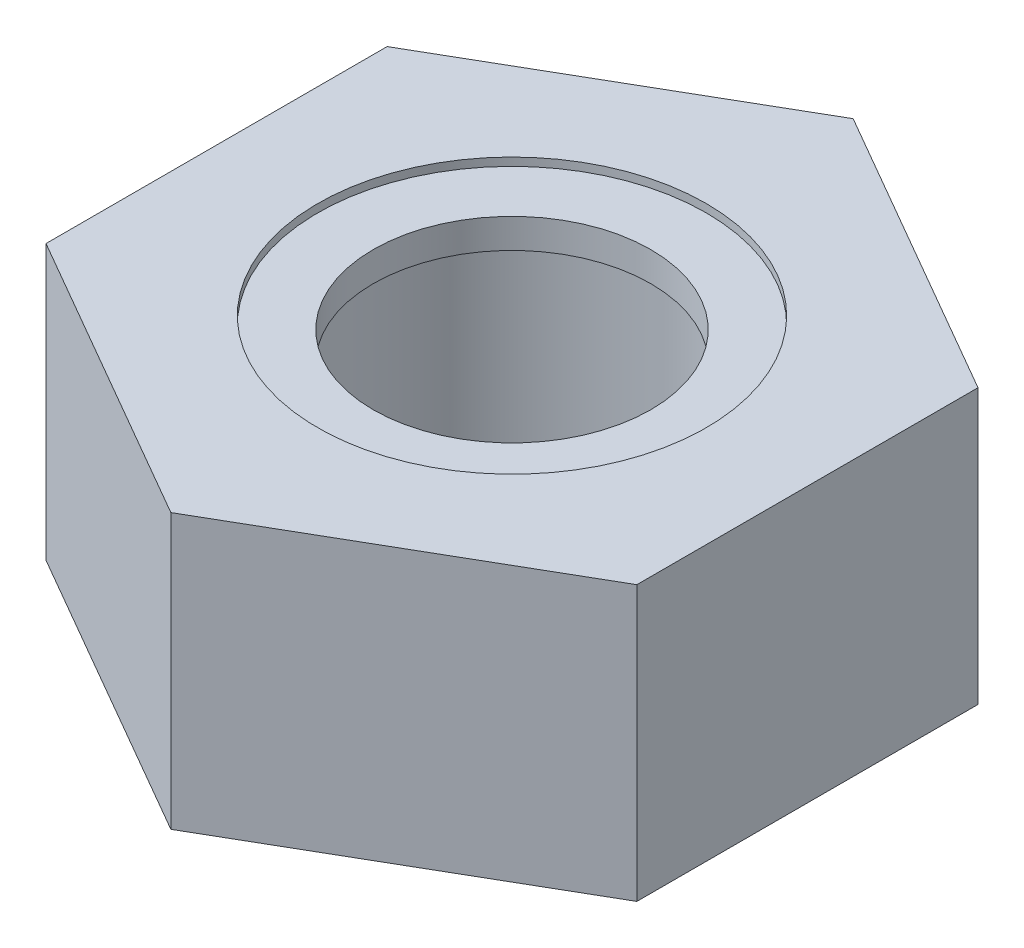
ISO-10303-21;
HEADER;
FILE_DESCRIPTION(('STEP AP214'),'2;1');
FILE_NAME('part.step','',(''),(''),'','','');
FILE_SCHEMA(('AUTOMOTIVE_DESIGN { 1 0 10303 214 1 1 1 1 }'));
ENDSEC;
DATA;
#1=APPLICATION_CONTEXT('core data for automotive mechanical design processes');
#2=APPLICATION_PROTOCOL_DEFINITION('international standard','automotive_design',2000,#1);
#3=PRODUCT_CONTEXT('',#1,'mechanical');
#4=PRODUCT('Part','Part','',(#3));
#5=PRODUCT_RELATED_PRODUCT_CATEGORY('part','',(#4));
#6=PRODUCT_DEFINITION_FORMATION('','',#4);
#7=PRODUCT_DEFINITION_CONTEXT('part definition',#1,'design');
#8=PRODUCT_DEFINITION('design','',#6,#7);
#9=PRODUCT_DEFINITION_SHAPE('','',#8);
#10=(LENGTH_UNIT() NAMED_UNIT(*) SI_UNIT(.MILLI.,.METRE.));
#11=(NAMED_UNIT(*) PLANE_ANGLE_UNIT() SI_UNIT($,.RADIAN.));
#12=(NAMED_UNIT(*) SI_UNIT($,.STERADIAN.) SOLID_ANGLE_UNIT());
#13=UNCERTAINTY_MEASURE_WITH_UNIT(LENGTH_MEASURE(1.E-05),#10,'distance_accuracy_value','');
#14=(GEOMETRIC_REPRESENTATION_CONTEXT(3) GLOBAL_UNCERTAINTY_ASSIGNED_CONTEXT((#13)) GLOBAL_UNIT_ASSIGNED_CONTEXT((#10,
#11,#12)) REPRESENTATION_CONTEXT('',''));
#15=CARTESIAN_POINT('',(0.,0.,0.));
#16=DIRECTION('',(0.,0.,1.));
#17=DIRECTION('',(1.,0.,0.));
#18=AXIS2_PLACEMENT_3D('',#15,#16,#17);
#19=CARTESIAN_POINT('',(0.,4.37567916666667,0.));
#20=DIRECTION('',(0.,-1.,0.));
#21=DIRECTION('',(0.,0.,-1.));
#22=AXIS2_PLACEMENT_3D('',#19,#20,#21);
#23=CYLINDRICAL_SURFACE('',#22,2.60990835569695);
#24=CARTESIAN_POINT('',(0.,4.37567916666667,0.));
#25=DIRECTION('',(0.,-1.,0.));
#26=DIRECTION('',(0.,0.,-1.));
#27=AXIS2_PLACEMENT_3D('',#24,#25,#26);
#28=CIRCLE('',#27,2.60990835569695);
#29=CARTESIAN_POINT('',(0.,4.37567916666667,-2.60990835569695));
#30=VERTEX_POINT('',#29);
#31=EDGE_CURVE('E11',#30,#30,#28,.T.);
#32=ORIENTED_EDGE('',*,*,#31,.T.);
#33=EDGE_LOOP('',(#32));
#34=FACE_BOUND('',#33,.T.);
#35=CARTESIAN_POINT('',(0.,4.930775,0.));
#36=DIRECTION('',(0.,-1.,0.));
#37=DIRECTION('',(0.,0.,-1.));
#38=AXIS2_PLACEMENT_3D('',#35,#36,#37);
#39=CIRCLE('',#38,2.60990835569695);
#40=CARTESIAN_POINT('',(0.,4.930775,-2.60990835569695));
#41=VERTEX_POINT('',#40);
#42=EDGE_CURVE('E58',#41,#41,#39,.T.);
#43=ORIENTED_EDGE('',*,*,#42,.F.);
#44=EDGE_LOOP('',(#43));
#45=FACE_BOUND('',#44,.T.);
#46=ADVANCED_FACE('F44',(#34,#45),#23,.F.);
#47=CARTESIAN_POINT('',(0.,4.37567916666667,-2.60990835569695));
#48=DIRECTION('',(0.,-1.,0.));
#49=DIRECTION('',(0.,0.,-1.));
#50=AXIS2_PLACEMENT_3D('',#47,#48,#49);
#51=PLANE('',#50);
#52=CARTESIAN_POINT('',(0.,4.37567916666666,0.));
#53=DIRECTION('',(0.,-1.,0.));
#54=DIRECTION('',(0.,0.,-1.));
#55=AXIS2_PLACEMENT_3D('',#52,#53,#54);
#56=CIRCLE('',#55,5.32303429973618);
#57=CARTESIAN_POINT('',(0.,4.37567916666667,-5.32303429973618));
#58=VERTEX_POINT('',#57);
#59=EDGE_CURVE('E50',#58,#58,#56,.T.);
#60=ORIENTED_EDGE('',*,*,#59,.T.);
#61=EDGE_LOOP('',(#60));
#62=FACE_BOUND('',#61,.T.);
#63=ORIENTED_EDGE('',*,*,#31,.F.);
#64=EDGE_LOOP('',(#63));
#65=FACE_BOUND('',#64,.T.);
#66=ADVANCED_FACE('F68',(#62,#65),#51,.T.);
#67=CARTESIAN_POINT('',(0.,4.29947916666666,0.));
#68=DIRECTION('',(0.,-1.,0.));
#69=DIRECTION('',(0.,0.,-1.));
#70=AXIS2_PLACEMENT_3D('',#67,#68,#69);
#71=TOROIDAL_SURFACE('',#70,4.69635416666667,0.631295833333333);
#72=CARTESIAN_POINT('',(0.,4.930775,0.));
#73=DIRECTION('',(0.,-1.,0.));
#74=DIRECTION('',(0.,0.,-1.));
#75=AXIS2_PLACEMENT_3D('',#72,#73,#74);
#76=CIRCLE('',#75,4.69635416666667);
#77=CARTESIAN_POINT('',(0.,4.930775,-4.69635416666667));
#78=VERTEX_POINT('',#77);
#79=EDGE_CURVE('E54',#78,#78,#76,.T.);
#80=ORIENTED_EDGE('',*,*,#79,.T.);
#81=EDGE_LOOP('',(#80));
#82=FACE_BOUND('',#81,.T.);
#83=ORIENTED_EDGE('',*,*,#59,.F.);
#84=EDGE_LOOP('',(#83));
#85=FACE_BOUND('',#84,.T.);
#86=ADVANCED_FACE('F72',(#82,#85),#71,.T.);
#87=CARTESIAN_POINT('',(0.,4.930775,-4.69635416666667));
#88=DIRECTION('',(0.,1.,0.));
#89=DIRECTION('',(0.,0.,1.));
#90=AXIS2_PLACEMENT_3D('',#87,#88,#89);
#91=PLANE('',#90);
#92=ORIENTED_EDGE('',*,*,#42,.T.);
#93=EDGE_LOOP('',(#92));
#94=FACE_BOUND('',#93,.T.);
#95=ORIENTED_EDGE('',*,*,#79,.F.);
#96=EDGE_LOOP('',(#95));
#97=FACE_BOUND('',#96,.T.);
#98=ADVANCED_FACE('F64',(#94,#97),#91,.T.);
#99=CLOSED_SHELL('',(#46,#66,#86,#98));
#100=MANIFOLD_SOLID_BREP('B2',#99);
#101=CARTESIAN_POINT('',(5.55625,5.159375,-3.20790243318487));
#102=DIRECTION('',(-0.5,0.,0.866025403784439));
#103=DIRECTION('',(0.866025403784439,0.,0.5));
#104=AXIS2_PLACEMENT_3D('',#101,#102,#103);
#105=PLANE('',#104);
#106=DIRECTION('',(-0.866025403784439,0.,-0.5));
#107=VECTOR('',#106,1.);
#108=CARTESIAN_POINT('',(5.55625,0.,-3.20790243318487));
#109=LINE('',#108,#107);
#110=CARTESIAN_POINT('',(5.55625,0.,-3.20790243318487));
#111=VERTEX_POINT('',#110);
#112=CARTESIAN_POINT('',(0.,0.,-6.41580486636972));
#113=VERTEX_POINT('',#112);
#114=EDGE_CURVE('E191',#111,#113,#109,.T.);
#115=ORIENTED_EDGE('',*,*,#114,.T.);
#116=DIRECTION('',(0.,-1.,0.));
#117=VECTOR('',#116,1.);
#118=CARTESIAN_POINT('',(0.,5.159375,-6.41580486636972));
#119=LINE('',#118,#117);
#120=CARTESIAN_POINT('',(0.,5.159375,-6.41580486636972));
#121=VERTEX_POINT('',#120);
#122=EDGE_CURVE('E42',#121,#113,#119,.T.);
#123=ORIENTED_EDGE('',*,*,#122,.F.);
#124=DIRECTION('',(-0.866025403784439,0.,-0.5));
#125=VECTOR('',#124,1.);
#126=CARTESIAN_POINT('',(5.55625,5.159375,-3.20790243318487));
#127=LINE('',#126,#125);
#128=CARTESIAN_POINT('',(5.55625,5.159375,-3.20790243318487));
#129=VERTEX_POINT('',#128);
#130=EDGE_CURVE('E202',#129,#121,#127,.T.);
#131=ORIENTED_EDGE('',*,*,#130,.F.);
#132=DIRECTION('',(0.,-1.,0.));
#133=VECTOR('',#132,1.);
#134=CARTESIAN_POINT('',(5.55625,5.159375,-3.20790243318487));
#135=LINE('',#134,#133);
#136=EDGE_CURVE('E187',#129,#111,#135,.T.);
#137=ORIENTED_EDGE('',*,*,#136,.T.);
#138=EDGE_LOOP('',(#115,#123,#131,#137));
#139=FACE_BOUND('',#138,.T.);
#140=ADVANCED_FACE('F105',(#139),#105,.F.);
#141=CARTESIAN_POINT('',(0.,5.159375,-6.41580486636972));
#142=DIRECTION('',(0.5,0.,0.866025403784439));
#143=DIRECTION('',(0.866025403784439,0.,-0.5));
#144=AXIS2_PLACEMENT_3D('',#141,#142,#143);
#145=PLANE('',#144);
#146=DIRECTION('',(-0.866025403784439,0.,0.5));
#147=VECTOR('',#146,1.);
#148=CARTESIAN_POINT('',(0.,0.,-6.41580486636972));
#149=LINE('',#148,#147);
#150=CARTESIAN_POINT('',(-5.55625,0.,-3.20790243318487));
#151=VERTEX_POINT('',#150);
#152=EDGE_CURVE('E194',#113,#151,#149,.T.);
#153=ORIENTED_EDGE('',*,*,#152,.T.);
#154=DIRECTION('',(0.,-1.,0.));
#155=VECTOR('',#154,1.);
#156=CARTESIAN_POINT('',(-5.55625,5.159375,-3.20790243318487));
#157=LINE('',#156,#155);
#158=CARTESIAN_POINT('',(-5.55625,5.159375,-3.20790243318487));
#159=VERTEX_POINT('',#158);
#160=EDGE_CURVE('E114',#159,#151,#157,.T.);
#161=ORIENTED_EDGE('',*,*,#160,.F.);
#162=DIRECTION('',(-0.866025403784439,0.,0.5));
#163=VECTOR('',#162,1.);
#164=CARTESIAN_POINT('',(0.,5.159375,-6.41580486636972));
#165=LINE('',#164,#163);
#166=EDGE_CURVE('E160',#121,#159,#165,.T.);
#167=ORIENTED_EDGE('',*,*,#166,.F.);
#168=ORIENTED_EDGE('',*,*,#122,.T.);
#169=EDGE_LOOP('',(#153,#161,#167,#168));
#170=FACE_BOUND('',#169,.T.);
#171=ADVANCED_FACE('F228',(#170),#145,.F.);
#172=CARTESIAN_POINT('',(-5.55625,5.159375,-3.20790243318487));
#173=DIRECTION('',(1.,0.,0.));
#174=DIRECTION('',(0.,0.,-1.));
#175=AXIS2_PLACEMENT_3D('',#172,#173,#174);
#176=PLANE('',#175);
#177=DIRECTION('',(0.,0.,1.));
#178=VECTOR('',#177,1.);
#179=CARTESIAN_POINT('',(-5.55625,0.,-3.20790243318487));
#180=LINE('',#179,#178);
#181=CARTESIAN_POINT('',(-5.55625,0.,3.20790243318485));
#182=VERTEX_POINT('',#181);
#183=EDGE_CURVE('E197',#151,#182,#180,.T.);
#184=ORIENTED_EDGE('',*,*,#183,.T.);
#185=DIRECTION('',(0.,-1.,0.));
#186=VECTOR('',#185,1.);
#187=CARTESIAN_POINT('',(-5.55625,5.159375,3.20790243318485));
#188=LINE('',#187,#186);
#189=CARTESIAN_POINT('',(-5.55625,5.159375,3.20790243318485));
#190=VERTEX_POINT('',#189);
#191=EDGE_CURVE('E182',#190,#182,#188,.T.);
#192=ORIENTED_EDGE('',*,*,#191,.F.);
#193=DIRECTION('',(0.,0.,1.));
#194=VECTOR('',#193,1.);
#195=CARTESIAN_POINT('',(-5.55625,5.159375,-3.20790243318487));
#196=LINE('',#195,#194);
#197=EDGE_CURVE('E173',#159,#190,#196,.T.);
#198=ORIENTED_EDGE('',*,*,#197,.F.);
#199=ORIENTED_EDGE('',*,*,#160,.T.);
#200=EDGE_LOOP('',(#184,#192,#198,#199));
#201=FACE_BOUND('',#200,.T.);
#202=ADVANCED_FACE('F231',(#201),#176,.F.);
#203=CARTESIAN_POINT('',(-5.55625,5.159375,3.20790243318485));
#204=DIRECTION('',(0.5,0.,-0.866025403784439));
#205=DIRECTION('',(-0.866025403784439,0.,-0.5));
#206=AXIS2_PLACEMENT_3D('',#203,#204,#205);
#207=PLANE('',#206);
#208=DIRECTION('',(0.866025403784439,0.,0.5));
#209=VECTOR('',#208,1.);
#210=CARTESIAN_POINT('',(-5.55625,0.,3.20790243318485));
#211=LINE('',#210,#209);
#212=CARTESIAN_POINT('',(0.,0.,6.41580486636971));
#213=VERTEX_POINT('',#212);
#214=EDGE_CURVE('E181',#182,#213,#211,.T.);
#215=ORIENTED_EDGE('',*,*,#214,.T.);
#216=DIRECTION('',(0.,-1.,0.));
#217=VECTOR('',#216,1.);
#218=CARTESIAN_POINT('',(0.,5.159375,6.41580486636971));
#219=LINE('',#218,#217);
#220=CARTESIAN_POINT('',(0.,5.159375,6.41580486636971));
#221=VERTEX_POINT('',#220);
#222=EDGE_CURVE('E178',#221,#213,#219,.T.);
#223=ORIENTED_EDGE('',*,*,#222,.F.);
#224=DIRECTION('',(0.866025403784439,0.,0.5));
#225=VECTOR('',#224,1.);
#226=CARTESIAN_POINT('',(-5.55625,5.159375,3.20790243318485));
#227=LINE('',#226,#225);
#228=EDGE_CURVE('E167',#190,#221,#227,.T.);
#229=ORIENTED_EDGE('',*,*,#228,.F.);
#230=ORIENTED_EDGE('',*,*,#191,.T.);
#231=EDGE_LOOP('',(#215,#223,#229,#230));
#232=FACE_BOUND('',#231,.T.);
#233=ADVANCED_FACE('F179',(#232),#207,.F.);
#234=CARTESIAN_POINT('',(0.,5.159375,6.41580486636971));
#235=DIRECTION('',(-0.5,0.,-0.866025403784439));
#236=DIRECTION('',(-0.866025403784439,0.,0.5));
#237=AXIS2_PLACEMENT_3D('',#234,#235,#236);
#238=PLANE('',#237);
#239=DIRECTION('',(0.866025403784439,0.,-0.5));
#240=VECTOR('',#239,1.);
#241=CARTESIAN_POINT('',(0.,0.,6.41580486636971));
#242=LINE('',#241,#240);
#243=CARTESIAN_POINT('',(5.55625,0.,3.20790243318485));
#244=VERTEX_POINT('',#243);
#245=EDGE_CURVE('E146',#213,#244,#242,.T.);
#246=ORIENTED_EDGE('',*,*,#245,.T.);
#247=DIRECTION('',(0.,-1.,0.));
#248=VECTOR('',#247,1.);
#249=CARTESIAN_POINT('',(5.55625,5.159375,3.20790243318485));
#250=LINE('',#249,#248);
#251=CARTESIAN_POINT('',(5.55625,5.159375,3.20790243318485));
#252=VERTEX_POINT('',#251);
#253=EDGE_CURVE('E183',#252,#244,#250,.T.);
#254=ORIENTED_EDGE('',*,*,#253,.F.);
#255=DIRECTION('',(0.866025403784439,0.,-0.5));
#256=VECTOR('',#255,1.);
#257=CARTESIAN_POINT('',(0.,5.159375,6.41580486636971));
#258=LINE('',#257,#256);
#259=EDGE_CURVE('E171',#221,#252,#258,.T.);
#260=ORIENTED_EDGE('',*,*,#259,.F.);
#261=ORIENTED_EDGE('',*,*,#222,.T.);
#262=EDGE_LOOP('',(#246,#254,#260,#261));
#263=FACE_BOUND('',#262,.T.);
#264=ADVANCED_FACE('F185',(#263),#238,.F.);
#265=CARTESIAN_POINT('',(5.55625,5.159375,3.20790243318485));
#266=DIRECTION('',(-1.,0.,0.));
#267=DIRECTION('',(0.,0.,1.));
#268=AXIS2_PLACEMENT_3D('',#265,#266,#267);
#269=PLANE('',#268);
#270=DIRECTION('',(0.,0.,-1.));
#271=VECTOR('',#270,1.);
#272=CARTESIAN_POINT('',(5.55625,0.,3.20790243318485));
#273=LINE('',#272,#271);
#274=EDGE_CURVE('E152',#244,#111,#273,.T.);
#275=ORIENTED_EDGE('',*,*,#274,.T.);
#276=ORIENTED_EDGE('',*,*,#136,.F.);
#277=DIRECTION('',(0.,0.,-1.));
#278=VECTOR('',#277,1.);
#279=CARTESIAN_POINT('',(5.55625,5.159375,3.20790243318485));
#280=LINE('',#279,#278);
#281=EDGE_CURVE('E123',#252,#129,#280,.T.);
#282=ORIENTED_EDGE('',*,*,#281,.F.);
#283=ORIENTED_EDGE('',*,*,#253,.T.);
#284=EDGE_LOOP('',(#275,#276,#282,#283));
#285=FACE_BOUND('',#284,.T.);
#286=ADVANCED_FACE('F236',(#285),#269,.F.);
#287=CARTESIAN_POINT('',(5.55625,5.159375,-3.20790243318487));
#288=DIRECTION('',(0.,-1.,0.));
#289=DIRECTION('',(0.,0.,-1.));
#290=AXIS2_PLACEMENT_3D('',#287,#288,#289);
#291=PLANE('',#290);
#292=CARTESIAN_POINT('',(0.,5.159375,0.));
#293=DIRECTION('',(0.,-1.,0.));
#294=DIRECTION('',(0.,0.,-1.));
#295=AXIS2_PLACEMENT_3D('',#292,#293,#294);
#296=CIRCLE('',#295,3.65313126118181);
#297=CARTESIAN_POINT('',(0.,5.159375,-3.65313126118181));
#298=VERTEX_POINT('',#297);
#299=EDGE_CURVE('E108',#298,#298,#296,.T.);
#300=ORIENTED_EDGE('',*,*,#299,.T.);
#301=EDGE_LOOP('',(#300));
#302=FACE_BOUND('',#301,.T.);
#303=ORIENTED_EDGE('',*,*,#130,.T.);
#304=ORIENTED_EDGE('',*,*,#166,.T.);
#305=ORIENTED_EDGE('',*,*,#197,.T.);
#306=ORIENTED_EDGE('',*,*,#228,.T.);
#307=ORIENTED_EDGE('',*,*,#259,.T.);
#308=ORIENTED_EDGE('',*,*,#281,.T.);
#309=EDGE_LOOP('',(#303,#304,#305,#306,#307,#308));
#310=FACE_BOUND('',#309,.T.);
#311=ADVANCED_FACE('F169',(#302,#310),#291,.F.);
#312=CARTESIAN_POINT('',(5.55625,0.,-3.20790243318487));
#313=DIRECTION('',(0.,-1.,0.));
#314=DIRECTION('',(0.,0.,-1.));
#315=AXIS2_PLACEMENT_3D('',#312,#313,#314);
#316=PLANE('',#315);
#317=CARTESIAN_POINT('',(0.,0.,0.));
#318=DIRECTION('',(0.,-1.,0.));
#319=DIRECTION('',(0.,0.,-1.));
#320=AXIS2_PLACEMENT_3D('',#317,#318,#319);
#321=CIRCLE('',#320,3.175);
#322=CARTESIAN_POINT('',(0.,0.,-3.175));
#323=VERTEX_POINT('',#322);
#324=EDGE_CURVE('E195',#323,#323,#321,.T.);
#325=ORIENTED_EDGE('',*,*,#324,.F.);
#326=EDGE_LOOP('',(#325));
#327=FACE_BOUND('',#326,.T.);
#328=ORIENTED_EDGE('',*,*,#114,.F.);
#329=ORIENTED_EDGE('',*,*,#274,.F.);
#330=ORIENTED_EDGE('',*,*,#245,.F.);
#331=ORIENTED_EDGE('',*,*,#214,.F.);
#332=ORIENTED_EDGE('',*,*,#183,.F.);
#333=ORIENTED_EDGE('',*,*,#152,.F.);
#334=EDGE_LOOP('',(#328,#329,#330,#331,#332,#333));
#335=FACE_BOUND('',#334,.T.);
#336=ADVANCED_FACE('F234',(#327,#335),#316,.T.);
#337=CARTESIAN_POINT('',(0.,-3.175,0.));
#338=DIRECTION('',(0.,-1.,0.));
#339=DIRECTION('',(0.,0.,-1.));
#340=AXIS2_PLACEMENT_3D('',#337,#338,#339);
#341=CYLINDRICAL_SURFACE('',#340,3.175);
#342=CARTESIAN_POINT('',(0.,4.29947916666667,0.));
#343=DIRECTION('',(0.,-1.,0.));
#344=DIRECTION('',(0.,0.,-1.));
#345=AXIS2_PLACEMENT_3D('',#342,#343,#344);
#346=CIRCLE('',#345,3.175);
#347=CARTESIAN_POINT('',(0.,4.29947916666667,-3.175));
#348=VERTEX_POINT('',#347);
#349=EDGE_CURVE('E207',#348,#348,#346,.F.);
#350=ORIENTED_EDGE('',*,*,#349,.T.);
#351=EDGE_LOOP('',(#350));
#352=FACE_BOUND('',#351,.T.);
#353=ORIENTED_EDGE('',*,*,#324,.T.);
#354=EDGE_LOOP('',(#353));
#355=FACE_BOUND('',#354,.T.);
#356=ADVANCED_FACE('F292',(#352,#355),#341,.F.);
#357=CARTESIAN_POINT('',(0.,6.429375,0.));
#358=DIRECTION('',(0.,-1.,0.));
#359=DIRECTION('',(0.,0.,-1.));
#360=AXIS2_PLACEMENT_3D('',#357,#358,#359);
#361=CYLINDRICAL_SURFACE('',#360,3.65313126118181);
#362=CARTESIAN_POINT('',(0.,5.006975,0.));
#363=DIRECTION('',(0.,-1.,0.));
#364=DIRECTION('',(0.,0.,-1.));
#365=AXIS2_PLACEMENT_3D('',#362,#363,#364);
#366=CIRCLE('',#365,3.65313126118181);
#367=CARTESIAN_POINT('',(0.,5.006975,-3.65313126118181));
#368=VERTEX_POINT('',#367);
#369=EDGE_CURVE('E219',#368,#368,#366,.T.);
#370=ORIENTED_EDGE('',*,*,#369,.T.);
#371=EDGE_LOOP('',(#370));
#372=FACE_BOUND('',#371,.T.);
#373=ORIENTED_EDGE('',*,*,#299,.F.);
#374=EDGE_LOOP('',(#373));
#375=FACE_BOUND('',#374,.T.);
#376=ADVANCED_FACE('F304',(#372,#375),#361,.F.);
#377=CARTESIAN_POINT('',(0.,4.29947916666667,0.));
#378=DIRECTION('',(0.,-1.,0.));
#379=DIRECTION('',(0.,0.,-1.));
#380=AXIS2_PLACEMENT_3D('',#377,#378,#379);
#381=PLANE('',#380);
#382=CARTESIAN_POINT('',(0.,4.29947916666667,0.));
#383=DIRECTION('',(0.,-1.,0.));
#384=DIRECTION('',(0.,0.,-1.));
#385=AXIS2_PLACEMENT_3D('',#382,#383,#384);
#386=CIRCLE('',#385,5.40385);
#387=CARTESIAN_POINT('',(0.,4.29947916666667,-5.40385));
#388=VERTEX_POINT('',#387);
#389=EDGE_CURVE('E209',#388,#388,#386,.T.);
#390=ORIENTED_EDGE('',*,*,#389,.F.);
#391=EDGE_LOOP('',(#390));
#392=FACE_BOUND('',#391,.T.);
#393=ORIENTED_EDGE('',*,*,#349,.F.);
#394=EDGE_LOOP('',(#393));
#395=FACE_BOUND('',#394,.T.);
#396=ADVANCED_FACE('F311',(#392,#395),#381,.F.);
#397=CARTESIAN_POINT('',(0.,4.29947916666667,0.));
#398=DIRECTION('',(0.,-1.,0.));
#399=DIRECTION('',(0.,0.,-1.));
#400=AXIS2_PLACEMENT_3D('',#397,#398,#399);
#401=TOROIDAL_SURFACE('',#400,4.69635416666666,0.707495833333332);
#402=CARTESIAN_POINT('',(0.,5.006975,0.));
#403=DIRECTION('',(0.,-1.,0.));
#404=DIRECTION('',(0.,0.,-1.));
#405=AXIS2_PLACEMENT_3D('',#402,#403,#404);
#406=CIRCLE('',#405,4.69635416666666);
#407=CARTESIAN_POINT('',(0.,5.006975,-4.69635416666667));
#408=VERTEX_POINT('',#407);
#409=EDGE_CURVE('E214',#408,#408,#406,.T.);
#410=ORIENTED_EDGE('',*,*,#409,.F.);
#411=EDGE_LOOP('',(#410));
#412=FACE_BOUND('',#411,.T.);
#413=ORIENTED_EDGE('',*,*,#389,.T.);
#414=EDGE_LOOP('',(#413));
#415=FACE_BOUND('',#414,.T.);
#416=ADVANCED_FACE('F321',(#412,#415),#401,.F.);
#417=CARTESIAN_POINT('',(0.,5.006975,-4.69635416666667));
#418=DIRECTION('',(0.,1.,0.));
#419=DIRECTION('',(0.,0.,1.));
#420=AXIS2_PLACEMENT_3D('',#417,#418,#419);
#421=PLANE('',#420);
#422=ORIENTED_EDGE('',*,*,#369,.F.);
#423=EDGE_LOOP('',(#422));
#424=FACE_BOUND('',#423,.T.);
#425=ORIENTED_EDGE('',*,*,#409,.T.);
#426=EDGE_LOOP('',(#425));
#427=FACE_BOUND('',#426,.T.);
#428=ADVANCED_FACE('F331',(#424,#427),#421,.F.);
#429=CLOSED_SHELL('',(#140,#171,#202,#233,#264,#286,#311,#336,#356,#376,#396,#416,#428));
#430=MANIFOLD_SOLID_BREP('B6',#429);
#431=ADVANCED_BREP_SHAPE_REPRESENTATION('',(#18,#100,#430),#14);
#432=SHAPE_DEFINITION_REPRESENTATION(#9,#431);
ENDSEC;
END-ISO-10303-21;
